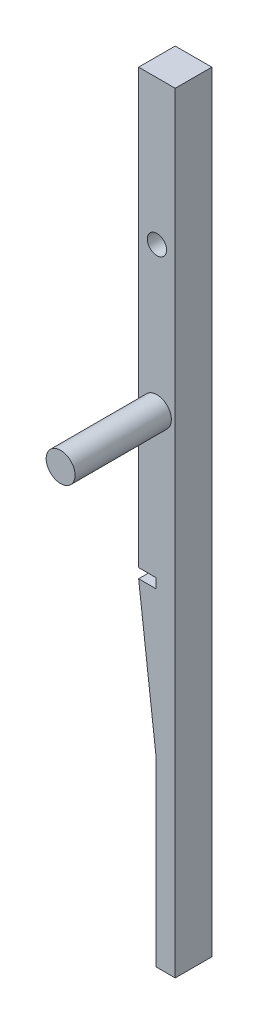
ISO-10303-21;
HEADER;
FILE_DESCRIPTION(('STEP AP214'),'2;1');
FILE_NAME('part.step','',(''),(''),'','','');
FILE_SCHEMA(('AUTOMOTIVE_DESIGN { 1 0 10303 214 1 1 1 1 }'));
ENDSEC;
DATA;
#1=APPLICATION_CONTEXT('core data for automotive mechanical design processes');
#2=APPLICATION_PROTOCOL_DEFINITION('international standard','automotive_design',2000,#1);
#3=PRODUCT_CONTEXT('',#1,'mechanical');
#4=PRODUCT('Part','Part','',(#3));
#5=PRODUCT_RELATED_PRODUCT_CATEGORY('part','',(#4));
#6=PRODUCT_DEFINITION_FORMATION('','',#4);
#7=PRODUCT_DEFINITION_CONTEXT('part definition',#1,'design');
#8=PRODUCT_DEFINITION('design','',#6,#7);
#9=PRODUCT_DEFINITION_SHAPE('','',#8);
#10=(LENGTH_UNIT() NAMED_UNIT(*) SI_UNIT(.MILLI.,.METRE.));
#11=(NAMED_UNIT(*) PLANE_ANGLE_UNIT() SI_UNIT($,.RADIAN.));
#12=(NAMED_UNIT(*) SI_UNIT($,.STERADIAN.) SOLID_ANGLE_UNIT());
#13=UNCERTAINTY_MEASURE_WITH_UNIT(LENGTH_MEASURE(1.E-05),#10,'distance_accuracy_value','');
#14=(GEOMETRIC_REPRESENTATION_CONTEXT(3) GLOBAL_UNCERTAINTY_ASSIGNED_CONTEXT((#13)) GLOBAL_UNIT_ASSIGNED_CONTEXT((#10,
#11,#12)) REPRESENTATION_CONTEXT('',''));
#15=CARTESIAN_POINT('',(0.,0.,0.));
#16=DIRECTION('',(0.,0.,1.));
#17=DIRECTION('',(1.,0.,0.));
#18=AXIS2_PLACEMENT_3D('',#15,#16,#17);
#19=CARTESIAN_POINT('',(-16.5243502051983,-17.375,3.8));
#20=DIRECTION('',(0.,1.,0.));
#21=DIRECTION('',(0.,0.,1.));
#22=AXIS2_PLACEMENT_3D('',#19,#20,#21);
#23=PLANE('',#22);
#24=DIRECTION('',(0.,0.,-1.));
#25=VECTOR('',#24,1.);
#26=CARTESIAN_POINT('',(-14.7243502051984,-17.375,0.));
#27=LINE('',#26,#25);
#28=CARTESIAN_POINT('',(-14.7243502051984,-17.375,3.8));
#29=VERTEX_POINT('',#28);
#30=CARTESIAN_POINT('',(-14.7243502051984,-17.375,0.));
#31=VERTEX_POINT('',#30);
#32=EDGE_CURVE('E51',#29,#31,#27,.T.);
#33=ORIENTED_EDGE('',*,*,#32,.F.);
#34=DIRECTION('',(1.,0.,0.));
#35=VECTOR('',#34,1.);
#36=CARTESIAN_POINT('',(-16.5243502051983,-17.375,3.8));
#37=LINE('',#36,#35);
#38=CARTESIAN_POINT('',(-16.5243502051983,-17.375,3.8));
#39=VERTEX_POINT('',#38);
#40=EDGE_CURVE('E118',#39,#29,#37,.T.);
#41=ORIENTED_EDGE('',*,*,#40,.F.);
#42=DIRECTION('',(0.,0.,-1.));
#43=VECTOR('',#42,1.);
#44=CARTESIAN_POINT('',(-16.5243502051983,-17.375,3.8));
#45=LINE('',#44,#43);
#46=CARTESIAN_POINT('',(-16.5243502051983,-17.375,0.));
#47=VERTEX_POINT('',#46);
#48=EDGE_CURVE('E43',#39,#47,#45,.T.);
#49=ORIENTED_EDGE('',*,*,#48,.T.);
#50=DIRECTION('',(1.,0.,0.));
#51=VECTOR('',#50,1.);
#52=CARTESIAN_POINT('',(-16.5243502051983,-17.375,0.));
#53=LINE('',#52,#51);
#54=EDGE_CURVE('E223',#47,#31,#53,.T.);
#55=ORIENTED_EDGE('',*,*,#54,.T.);
#56=EDGE_LOOP('',(#33,#41,#49,#55));
#57=FACE_BOUND('',#56,.T.);
#58=ADVANCED_FACE('F33',(#57),#23,.F.);
#59=CARTESIAN_POINT('',(0.,0.,3.8));
#60=DIRECTION('',(0.,0.,1.));
#61=DIRECTION('',(1.,0.,0.));
#62=AXIS2_PLACEMENT_3D('',#59,#60,#61);
#63=PLANE('',#62);
#64=CARTESIAN_POINT('',(-14.6243502051984,12.625,3.8));
#65=DIRECTION('',(0.,0.,1.));
#66=DIRECTION('',(1.,0.,0.));
#67=AXIS2_PLACEMENT_3D('',#64,#65,#66);
#68=CIRCLE('',#67,1.);
#69=CARTESIAN_POINT('',(-13.6243502051984,12.625,3.8));
#70=VERTEX_POINT('',#69);
#71=EDGE_CURVE('E154',#70,#70,#68,.T.);
#72=ORIENTED_EDGE('',*,*,#71,.F.);
#73=EDGE_LOOP('',(#72));
#74=FACE_BOUND('',#73,.T.);
#75=DIRECTION('',(-1.,0.,0.));
#76=VECTOR('',#75,1.);
#77=CARTESIAN_POINT('',(-12.7243502051984,27.625,3.8));
#78=LINE('',#77,#76);
#79=CARTESIAN_POINT('',(-12.7243502051984,27.625,3.8));
#80=VERTEX_POINT('',#79);
#81=CARTESIAN_POINT('',(-16.5243502051984,27.625,3.8));
#82=VERTEX_POINT('',#81);
#83=EDGE_CURVE('E228',#80,#82,#78,.T.);
#84=ORIENTED_EDGE('',*,*,#83,.T.);
#85=DIRECTION('',(0.,-1.,0.));
#86=VECTOR('',#85,1.);
#87=CARTESIAN_POINT('',(-16.5243502051984,27.625,3.8));
#88=LINE('',#87,#86);
#89=EDGE_CURVE('E83',#82,#39,#88,.T.);
#90=ORIENTED_EDGE('',*,*,#89,.T.);
#91=ORIENTED_EDGE('',*,*,#40,.T.);
#92=DIRECTION('',(0.,1.,0.));
#93=VECTOR('',#92,1.);
#94=CARTESIAN_POINT('',(-14.7243502051984,-18.375,3.8));
#95=LINE('',#94,#93);
#96=CARTESIAN_POINT('',(-14.7243502051984,-18.375,3.8));
#97=VERTEX_POINT('',#96);
#98=EDGE_CURVE('E172',#97,#29,#95,.T.);
#99=ORIENTED_EDGE('',*,*,#98,.F.);
#100=DIRECTION('',(-1.,0.,0.));
#101=VECTOR('',#100,1.);
#102=CARTESIAN_POINT('',(-16.5243502051984,-18.375,3.8));
#103=LINE('',#102,#101);
#104=CARTESIAN_POINT('',(-16.5243502051984,-18.375,3.8));
#105=VERTEX_POINT('',#104);
#106=EDGE_CURVE('E143',#97,#105,#103,.T.);
#107=ORIENTED_EDGE('',*,*,#106,.T.);
#108=DIRECTION('',(0.119145220618431,-0.992876838486922,0.));
#109=VECTOR('',#108,1.);
#110=CARTESIAN_POINT('',(-14.7243502051984,-33.375,3.8));
#111=LINE('',#110,#109);
#112=CARTESIAN_POINT('',(-14.7243502051984,-33.375,3.8));
#113=VERTEX_POINT('',#112);
#114=EDGE_CURVE('E152',#105,#113,#111,.T.);
#115=ORIENTED_EDGE('',*,*,#114,.T.);
#116=DIRECTION('',(0.,1.,0.));
#117=VECTOR('',#116,1.);
#118=CARTESIAN_POINT('',(-14.7243502051984,-52.375,3.8));
#119=LINE('',#118,#117);
#120=CARTESIAN_POINT('',(-14.7243502051984,-52.375,3.8));
#121=VERTEX_POINT('',#120);
#122=EDGE_CURVE('E126',#121,#113,#119,.T.);
#123=ORIENTED_EDGE('',*,*,#122,.F.);
#124=DIRECTION('',(-1.,0.,0.));
#125=VECTOR('',#124,1.);
#126=CARTESIAN_POINT('',(-12.7243502051984,-52.375,3.8));
#127=LINE('',#126,#125);
#128=CARTESIAN_POINT('',(-12.7243502051984,-52.375,3.8));
#129=VERTEX_POINT('',#128);
#130=EDGE_CURVE('E121',#129,#121,#127,.T.);
#131=ORIENTED_EDGE('',*,*,#130,.F.);
#132=DIRECTION('',(0.,1.,0.));
#133=VECTOR('',#132,1.);
#134=CARTESIAN_POINT('',(-12.7243502051984,-17.375,3.8));
#135=LINE('',#134,#133);
#136=EDGE_CURVE('E60',#129,#80,#135,.T.);
#137=ORIENTED_EDGE('',*,*,#136,.T.);
#138=EDGE_LOOP('',(#84,#90,#91,#99,#107,#115,#123,#131,#137));
#139=FACE_BOUND('',#138,.T.);
#140=CARTESIAN_POINT('',(-14.6243502051984,-2.375,3.8));
#141=DIRECTION('',(0.,0.,1.));
#142=DIRECTION('',(1.,0.,0.));
#143=AXIS2_PLACEMENT_3D('',#140,#141,#142);
#144=CIRCLE('',#143,1.5);
#145=CARTESIAN_POINT('',(-13.1243502051984,-2.375,3.8));
#146=VERTEX_POINT('',#145);
#147=EDGE_CURVE('E177',#146,#146,#144,.T.);
#148=ORIENTED_EDGE('',*,*,#147,.F.);
#149=EDGE_LOOP('',(#148));
#150=FACE_BOUND('',#149,.T.);
#151=ADVANCED_FACE('F122',(#74,#139,#150),#63,.T.);
#152=CARTESIAN_POINT('',(-12.7243502051984,27.625,3.8));
#153=DIRECTION('',(0.,-1.,0.));
#154=DIRECTION('',(1.,0.,0.));
#155=AXIS2_PLACEMENT_3D('',#152,#153,#154);
#156=PLANE('',#155);
#157=DIRECTION('',(-1.,0.,0.));
#158=VECTOR('',#157,1.);
#159=CARTESIAN_POINT('',(-12.7243502051984,27.625,0.));
#160=LINE('',#159,#158);
#161=CARTESIAN_POINT('',(-12.7243502051984,27.625,0.));
#162=VERTEX_POINT('',#161);
#163=CARTESIAN_POINT('',(-16.5243502051984,27.625,0.));
#164=VERTEX_POINT('',#163);
#165=EDGE_CURVE('E224',#162,#164,#160,.T.);
#166=ORIENTED_EDGE('',*,*,#165,.T.);
#167=DIRECTION('',(0.,0.,-1.));
#168=VECTOR('',#167,1.);
#169=CARTESIAN_POINT('',(-16.5243502051984,27.625,3.8));
#170=LINE('',#169,#168);
#171=EDGE_CURVE('E11',#82,#164,#170,.T.);
#172=ORIENTED_EDGE('',*,*,#171,.F.);
#173=ORIENTED_EDGE('',*,*,#83,.F.);
#174=DIRECTION('',(0.,0.,-1.));
#175=VECTOR('',#174,1.);
#176=CARTESIAN_POINT('',(-12.7243502051984,27.625,3.8));
#177=LINE('',#176,#175);
#178=EDGE_CURVE('E116',#80,#162,#177,.T.);
#179=ORIENTED_EDGE('',*,*,#178,.T.);
#180=EDGE_LOOP('',(#166,#172,#173,#179));
#181=FACE_BOUND('',#180,.T.);
#182=ADVANCED_FACE('F35',(#181),#156,.F.);
#183=CARTESIAN_POINT('',(-16.5243502051984,27.625,3.8));
#184=DIRECTION('',(1.,0.,0.));
#185=DIRECTION('',(0.,1.,0.));
#186=AXIS2_PLACEMENT_3D('',#183,#184,#185);
#187=PLANE('',#186);
#188=DIRECTION('',(0.,-1.,0.));
#189=VECTOR('',#188,1.);
#190=CARTESIAN_POINT('',(-16.5243502051984,27.625,0.));
#191=LINE('',#190,#189);
#192=EDGE_CURVE('E217',#164,#47,#191,.T.);
#193=ORIENTED_EDGE('',*,*,#192,.T.);
#194=ORIENTED_EDGE('',*,*,#48,.F.);
#195=ORIENTED_EDGE('',*,*,#89,.F.);
#196=ORIENTED_EDGE('',*,*,#171,.T.);
#197=EDGE_LOOP('',(#193,#194,#195,#196));
#198=FACE_BOUND('',#197,.T.);
#199=ADVANCED_FACE('F210',(#198),#187,.F.);
#200=CARTESIAN_POINT('',(-12.7243502051984,-17.375,3.8));
#201=DIRECTION('',(-1.,0.,0.));
#202=DIRECTION('',(0.,0.,1.));
#203=AXIS2_PLACEMENT_3D('',#200,#201,#202);
#204=PLANE('',#203);
#205=DIRECTION('',(0.,1.,0.));
#206=VECTOR('',#205,1.);
#207=CARTESIAN_POINT('',(-12.7243502051984,-17.375,0.));
#208=LINE('',#207,#206);
#209=CARTESIAN_POINT('',(-12.7243502051984,-52.375,0.));
#210=VERTEX_POINT('',#209);
#211=EDGE_CURVE('E78',#210,#162,#208,.T.);
#212=ORIENTED_EDGE('',*,*,#211,.T.);
#213=ORIENTED_EDGE('',*,*,#178,.F.);
#214=ORIENTED_EDGE('',*,*,#136,.F.);
#215=DIRECTION('',(0.,0.,1.));
#216=VECTOR('',#215,1.);
#217=CARTESIAN_POINT('',(-12.7243502051984,-52.375,0.));
#218=LINE('',#217,#216);
#219=EDGE_CURVE('E115',#210,#129,#218,.T.);
#220=ORIENTED_EDGE('',*,*,#219,.F.);
#221=EDGE_LOOP('',(#212,#213,#214,#220));
#222=FACE_BOUND('',#221,.T.);
#223=ADVANCED_FACE('F113',(#222),#204,.F.);
#224=CARTESIAN_POINT('',(0.,0.,0.));
#225=DIRECTION('',(0.,0.,1.));
#226=DIRECTION('',(1.,0.,0.));
#227=AXIS2_PLACEMENT_3D('',#224,#225,#226);
#228=PLANE('',#227);
#229=CARTESIAN_POINT('',(-14.6243502051984,12.625,0.));
#230=DIRECTION('',(0.,0.,1.));
#231=DIRECTION('',(1.,0.,0.));
#232=AXIS2_PLACEMENT_3D('',#229,#230,#231);
#233=CIRCLE('',#232,1.);
#234=CARTESIAN_POINT('',(-13.6243502051984,12.625,0.));
#235=VERTEX_POINT('',#234);
#236=EDGE_CURVE('E156',#235,#235,#233,.T.);
#237=ORIENTED_EDGE('',*,*,#236,.T.);
#238=EDGE_LOOP('',(#237));
#239=FACE_BOUND('',#238,.T.);
#240=ORIENTED_EDGE('',*,*,#165,.F.);
#241=ORIENTED_EDGE('',*,*,#211,.F.);
#242=DIRECTION('',(1.,0.,0.));
#243=VECTOR('',#242,1.);
#244=CARTESIAN_POINT('',(-14.7243502051984,-52.375,0.));
#245=LINE('',#244,#243);
#246=CARTESIAN_POINT('',(-14.7243502051984,-52.375,0.));
#247=VERTEX_POINT('',#246);
#248=EDGE_CURVE('E134',#247,#210,#245,.T.);
#249=ORIENTED_EDGE('',*,*,#248,.F.);
#250=DIRECTION('',(0.,1.,0.));
#251=VECTOR('',#250,1.);
#252=CARTESIAN_POINT('',(-14.7243502051984,-52.375,0.));
#253=LINE('',#252,#251);
#254=CARTESIAN_POINT('',(-14.7243502051984,-33.375,0.));
#255=VERTEX_POINT('',#254);
#256=EDGE_CURVE('E139',#247,#255,#253,.T.);
#257=ORIENTED_EDGE('',*,*,#256,.T.);
#258=DIRECTION('',(0.119145220618431,-0.992876838486922,0.));
#259=VECTOR('',#258,1.);
#260=CARTESIAN_POINT('',(-14.7243502051984,-33.375,0.));
#261=LINE('',#260,#259);
#262=CARTESIAN_POINT('',(-16.5243502051984,-18.375,0.));
#263=VERTEX_POINT('',#262);
#264=EDGE_CURVE('E146',#263,#255,#261,.T.);
#265=ORIENTED_EDGE('',*,*,#264,.F.);
#266=DIRECTION('',(-1.,0.,0.));
#267=VECTOR('',#266,1.);
#268=CARTESIAN_POINT('',(-16.5243502051984,-18.375,0.));
#269=LINE('',#268,#267);
#270=CARTESIAN_POINT('',(-14.7243502051984,-18.375,0.));
#271=VERTEX_POINT('',#270);
#272=EDGE_CURVE('E149',#271,#263,#269,.T.);
#273=ORIENTED_EDGE('',*,*,#272,.F.);
#274=DIRECTION('',(0.,1.,0.));
#275=VECTOR('',#274,1.);
#276=CARTESIAN_POINT('',(-14.7243502051984,-18.375,0.));
#277=LINE('',#276,#275);
#278=EDGE_CURVE('E169',#271,#31,#277,.T.);
#279=ORIENTED_EDGE('',*,*,#278,.T.);
#280=ORIENTED_EDGE('',*,*,#54,.F.);
#281=ORIENTED_EDGE('',*,*,#192,.F.);
#282=EDGE_LOOP('',(#240,#241,#249,#257,#265,#273,#279,#280,#281));
#283=FACE_BOUND('',#282,.T.);
#284=ADVANCED_FACE('F182',(#239,#283),#228,.F.);
#285=CARTESIAN_POINT('',(-14.6243502051984,-2.375,13.8));
#286=DIRECTION('',(0.,0.,-1.));
#287=DIRECTION('',(-1.,0.,0.));
#288=AXIS2_PLACEMENT_3D('',#285,#286,#287);
#289=CYLINDRICAL_SURFACE('',#288,1.5);
#290=CARTESIAN_POINT('',(-14.6243502051984,-2.375,13.8));
#291=DIRECTION('',(0.,0.,1.));
#292=DIRECTION('',(1.,0.,0.));
#293=AXIS2_PLACEMENT_3D('',#290,#291,#292);
#294=CIRCLE('',#293,1.5);
#295=CARTESIAN_POINT('',(-13.1243502051984,-2.375,13.8));
#296=VERTEX_POINT('',#295);
#297=EDGE_CURVE('E162',#296,#296,#294,.T.);
#298=ORIENTED_EDGE('',*,*,#297,.F.);
#299=EDGE_LOOP('',(#298));
#300=FACE_BOUND('',#299,.T.);
#301=ORIENTED_EDGE('',*,*,#147,.T.);
#302=EDGE_LOOP('',(#301));
#303=FACE_BOUND('',#302,.T.);
#304=ADVANCED_FACE('F241',(#300,#303),#289,.T.);
#305=CARTESIAN_POINT('',(-14.6243502051984,-2.375,13.8));
#306=DIRECTION('',(0.,0.,1.));
#307=DIRECTION('',(1.,0.,0.));
#308=AXIS2_PLACEMENT_3D('',#305,#306,#307);
#309=PLANE('',#308);
#310=ORIENTED_EDGE('',*,*,#297,.T.);
#311=EDGE_LOOP('',(#310));
#312=FACE_BOUND('',#311,.T.);
#313=ADVANCED_FACE('F198',(#312),#309,.T.);
#314=CARTESIAN_POINT('',(-14.7243502051984,-18.375,0.));
#315=DIRECTION('',(1.,0.,0.));
#316=DIRECTION('',(0.,0.,-1.));
#317=AXIS2_PLACEMENT_3D('',#314,#315,#316);
#318=PLANE('',#317);
#319=ORIENTED_EDGE('',*,*,#32,.T.);
#320=ORIENTED_EDGE('',*,*,#278,.F.);
#321=DIRECTION('',(0.,0.,-1.));
#322=VECTOR('',#321,1.);
#323=CARTESIAN_POINT('',(-14.7243502051984,-18.375,0.));
#324=LINE('',#323,#322);
#325=EDGE_CURVE('E37',#97,#271,#324,.T.);
#326=ORIENTED_EDGE('',*,*,#325,.F.);
#327=ORIENTED_EDGE('',*,*,#98,.T.);
#328=EDGE_LOOP('',(#319,#320,#326,#327));
#329=FACE_BOUND('',#328,.T.);
#330=ADVANCED_FACE('F188',(#329),#318,.F.);
#331=CARTESIAN_POINT('',(-14.6243502051984,12.625,-0.199999999999993));
#332=DIRECTION('',(0.,0.,1.));
#333=DIRECTION('',(1.,0.,0.));
#334=AXIS2_PLACEMENT_3D('',#331,#332,#333);
#335=CYLINDRICAL_SURFACE('',#334,1.);
#336=ORIENTED_EDGE('',*,*,#71,.T.);
#337=EDGE_LOOP('',(#336));
#338=FACE_BOUND('',#337,.T.);
#339=ORIENTED_EDGE('',*,*,#236,.F.);
#340=EDGE_LOOP('',(#339));
#341=FACE_BOUND('',#340,.T.);
#342=ADVANCED_FACE('F185',(#338,#341),#335,.F.);
#343=CARTESIAN_POINT('',(-16.5243502051984,-18.375,0.));
#344=DIRECTION('',(0.,1.,0.));
#345=DIRECTION('',(0.,0.,1.));
#346=AXIS2_PLACEMENT_3D('',#343,#344,#345);
#347=PLANE('',#346);
#348=ORIENTED_EDGE('',*,*,#106,.F.);
#349=ORIENTED_EDGE('',*,*,#325,.T.);
#350=ORIENTED_EDGE('',*,*,#272,.T.);
#351=DIRECTION('',(0.,0.,1.));
#352=VECTOR('',#351,1.);
#353=CARTESIAN_POINT('',(-16.5243502051984,-18.375,0.));
#354=LINE('',#353,#352);
#355=EDGE_CURVE('E367',#263,#105,#354,.T.);
#356=ORIENTED_EDGE('',*,*,#355,.T.);
#357=EDGE_LOOP('',(#348,#349,#350,#356));
#358=FACE_BOUND('',#357,.T.);
#359=ADVANCED_FACE('F187',(#358),#347,.T.);
#360=CARTESIAN_POINT('',(-14.7243502051984,-33.375,0.));
#361=DIRECTION('',(-0.992876838486922,-0.119145220618431,0.));
#362=DIRECTION('',(0.119145220618431,-0.992876838486922,0.));
#363=AXIS2_PLACEMENT_3D('',#360,#361,#362);
#364=PLANE('',#363);
#365=ORIENTED_EDGE('',*,*,#114,.F.);
#366=ORIENTED_EDGE('',*,*,#355,.F.);
#367=ORIENTED_EDGE('',*,*,#264,.T.);
#368=DIRECTION('',(0.,0.,1.));
#369=VECTOR('',#368,1.);
#370=CARTESIAN_POINT('',(-14.7243502051984,-33.375,0.));
#371=LINE('',#370,#369);
#372=EDGE_CURVE('E157',#255,#113,#371,.T.);
#373=ORIENTED_EDGE('',*,*,#372,.T.);
#374=EDGE_LOOP('',(#365,#366,#367,#373));
#375=FACE_BOUND('',#374,.T.);
#376=ADVANCED_FACE('F195',(#375),#364,.T.);
#377=CARTESIAN_POINT('',(-14.7243502051984,-52.375,3.8));
#378=DIRECTION('',(1.,0.,0.));
#379=DIRECTION('',(0.,0.,-1.));
#380=AXIS2_PLACEMENT_3D('',#377,#378,#379);
#381=PLANE('',#380);
#382=ORIENTED_EDGE('',*,*,#372,.F.);
#383=ORIENTED_EDGE('',*,*,#256,.F.);
#384=DIRECTION('',(0.,0.,-1.));
#385=VECTOR('',#384,1.);
#386=CARTESIAN_POINT('',(-14.7243502051984,-52.375,3.8));
#387=LINE('',#386,#385);
#388=EDGE_CURVE('E129',#121,#247,#387,.T.);
#389=ORIENTED_EDGE('',*,*,#388,.F.);
#390=ORIENTED_EDGE('',*,*,#122,.T.);
#391=EDGE_LOOP('',(#382,#383,#389,#390));
#392=FACE_BOUND('',#391,.T.);
#393=ADVANCED_FACE('F341',(#392),#381,.F.);
#394=CARTESIAN_POINT('',(0.,-52.375,0.));
#395=DIRECTION('',(0.,-1.,0.));
#396=DIRECTION('',(0.,0.,-1.));
#397=AXIS2_PLACEMENT_3D('',#394,#395,#396);
#398=PLANE('',#397);
#399=ORIENTED_EDGE('',*,*,#219,.T.);
#400=ORIENTED_EDGE('',*,*,#130,.T.);
#401=ORIENTED_EDGE('',*,*,#388,.T.);
#402=ORIENTED_EDGE('',*,*,#248,.T.);
#403=EDGE_LOOP('',(#399,#400,#401,#402));
#404=FACE_BOUND('',#403,.T.);
#405=ADVANCED_FACE('F132',(#404),#398,.T.);
#406=CLOSED_SHELL('',(#58,#151,#182,#199,#223,#284,#304,#313,#330,#342,#359,#376,#393,#405));
#407=MANIFOLD_SOLID_BREP('B2',#406);
#408=ADVANCED_BREP_SHAPE_REPRESENTATION('',(#18,#407),#14);
#409=SHAPE_DEFINITION_REPRESENTATION(#9,#408);
ENDSEC;
END-ISO-10303-21;
